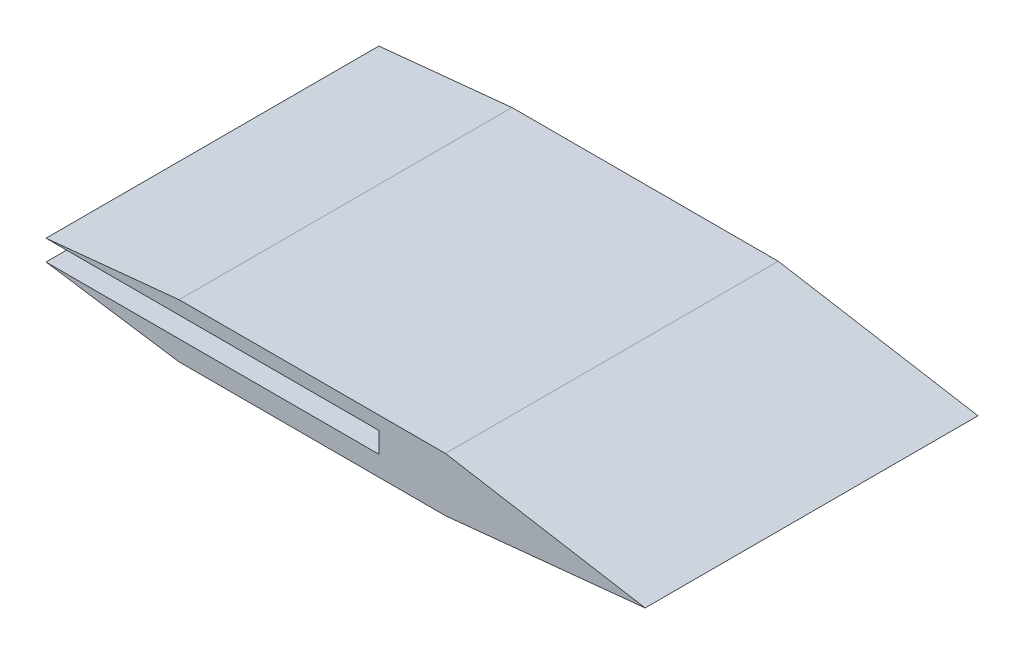
ISO-10303-21;
HEADER;
FILE_DESCRIPTION(('STEP AP214'),'2;1');
FILE_NAME('part.step','',(''),(''),'','','');
FILE_SCHEMA(('AUTOMOTIVE_DESIGN { 1 0 10303 214 1 1 1 1 }'));
ENDSEC;
DATA;
#1=APPLICATION_CONTEXT('core data for automotive mechanical design processes');
#2=APPLICATION_PROTOCOL_DEFINITION('international standard','automotive_design',2000,#1);
#3=PRODUCT_CONTEXT('',#1,'mechanical');
#4=PRODUCT('Part','Part','',(#3));
#5=PRODUCT_RELATED_PRODUCT_CATEGORY('part','',(#4));
#6=PRODUCT_DEFINITION_FORMATION('','',#4);
#7=PRODUCT_DEFINITION_CONTEXT('part definition',#1,'design');
#8=PRODUCT_DEFINITION('design','',#6,#7);
#9=PRODUCT_DEFINITION_SHAPE('','',#8);
#10=(LENGTH_UNIT() NAMED_UNIT(*) SI_UNIT(.MILLI.,.METRE.));
#11=(NAMED_UNIT(*) PLANE_ANGLE_UNIT() SI_UNIT($,.RADIAN.));
#12=(NAMED_UNIT(*) SI_UNIT($,.STERADIAN.) SOLID_ANGLE_UNIT());
#13=UNCERTAINTY_MEASURE_WITH_UNIT(LENGTH_MEASURE(1.E-05),#10,'distance_accuracy_value','');
#14=(GEOMETRIC_REPRESENTATION_CONTEXT(3) GLOBAL_UNCERTAINTY_ASSIGNED_CONTEXT((#13)) GLOBAL_UNIT_ASSIGNED_CONTEXT((#10,
#11,#12)) REPRESENTATION_CONTEXT('',''));
#15=CARTESIAN_POINT('',(0.,0.,0.));
#16=DIRECTION('',(0.,0.,1.));
#17=DIRECTION('',(1.,0.,0.));
#18=AXIS2_PLACEMENT_3D('',#15,#16,#17);
#19=CARTESIAN_POINT('',(50.,0.,50.));
#20=DIRECTION('',(0.,1.,0.));
#21=DIRECTION('',(-1.,0.,0.));
#22=AXIS2_PLACEMENT_3D('',#19,#20,#21);
#23=PLANE('',#22);
#24=DIRECTION('',(1.,0.,0.));
#25=VECTOR('',#24,1.);
#26=CARTESIAN_POINT('',(50.,0.,0.));
#27=LINE('',#26,#25);
#28=CARTESIAN_POINT('',(0.,0.,0.));
#29=VERTEX_POINT('',#28);
#30=CARTESIAN_POINT('',(50.,0.,0.));
#31=VERTEX_POINT('',#30);
#32=EDGE_CURVE('E135',#29,#31,#27,.T.);
#33=ORIENTED_EDGE('',*,*,#32,.T.);
#34=DIRECTION('',(0.,0.,-1.));
#35=VECTOR('',#34,1.);
#36=CARTESIAN_POINT('',(50.,0.,50.));
#37=LINE('',#36,#35);
#38=CARTESIAN_POINT('',(50.,0.,50.));
#39=VERTEX_POINT('',#38);
#40=EDGE_CURVE('E11',#39,#31,#37,.T.);
#41=ORIENTED_EDGE('',*,*,#40,.F.);
#42=DIRECTION('',(1.,0.,0.));
#43=VECTOR('',#42,1.);
#44=CARTESIAN_POINT('',(50.,0.,50.));
#45=LINE('',#44,#43);
#46=CARTESIAN_POINT('',(0.,0.,50.));
#47=VERTEX_POINT('',#46);
#48=EDGE_CURVE('E151',#47,#39,#45,.T.);
#49=ORIENTED_EDGE('',*,*,#48,.F.);
#50=DIRECTION('',(0.,0.,-1.));
#51=VECTOR('',#50,1.);
#52=CARTESIAN_POINT('',(0.,0.,50.));
#53=LINE('',#52,#51);
#54=EDGE_CURVE('E131',#47,#29,#53,.T.);
#55=ORIENTED_EDGE('',*,*,#54,.T.);
#56=EDGE_LOOP('',(#33,#41,#49,#55));
#57=FACE_BOUND('',#56,.T.);
#58=ADVANCED_FACE('F33',(#57),#23,.F.);
#59=CARTESIAN_POINT('',(50.,-3.1,50.));
#60=DIRECTION('',(1.,0.,0.));
#61=DIRECTION('',(0.,0.,-1.));
#62=AXIS2_PLACEMENT_3D('',#59,#60,#61);
#63=PLANE('',#62);
#64=DIRECTION('',(0.,-1.,0.));
#65=VECTOR('',#64,1.);
#66=CARTESIAN_POINT('',(50.,-3.1,0.));
#67=LINE('',#66,#65);
#68=CARTESIAN_POINT('',(50.,-3.1,0.));
#69=VERTEX_POINT('',#68);
#70=EDGE_CURVE('E138',#31,#69,#67,.T.);
#71=ORIENTED_EDGE('',*,*,#70,.T.);
#72=DIRECTION('',(0.,0.,-1.));
#73=VECTOR('',#72,1.);
#74=CARTESIAN_POINT('',(50.,-3.1,50.));
#75=LINE('',#74,#73);
#76=CARTESIAN_POINT('',(50.,-3.1,50.));
#77=VERTEX_POINT('',#76);
#78=EDGE_CURVE('E41',#77,#69,#75,.T.);
#79=ORIENTED_EDGE('',*,*,#78,.F.);
#80=DIRECTION('',(0.,-1.,0.));
#81=VECTOR('',#80,1.);
#82=CARTESIAN_POINT('',(50.,-3.1,50.));
#83=LINE('',#82,#81);
#84=EDGE_CURVE('E95',#39,#77,#83,.T.);
#85=ORIENTED_EDGE('',*,*,#84,.F.);
#86=ORIENTED_EDGE('',*,*,#40,.T.);
#87=EDGE_LOOP('',(#71,#79,#85,#86));
#88=FACE_BOUND('',#87,.T.);
#89=ADVANCED_FACE('F194',(#88),#63,.F.);
#90=CARTESIAN_POINT('',(0.,-3.1,50.));
#91=DIRECTION('',(0.,-1.,0.));
#92=DIRECTION('',(0.,0.,-1.));
#93=AXIS2_PLACEMENT_3D('',#90,#91,#92);
#94=PLANE('',#93);
#95=DIRECTION('',(-1.,0.,0.));
#96=VECTOR('',#95,1.);
#97=CARTESIAN_POINT('',(0.,-3.1,0.));
#98=LINE('',#97,#96);
#99=CARTESIAN_POINT('',(0.,-3.1,0.));
#100=VERTEX_POINT('',#99);
#101=EDGE_CURVE('E140',#69,#100,#98,.T.);
#102=ORIENTED_EDGE('',*,*,#101,.T.);
#103=DIRECTION('',(0.,0.,-1.));
#104=VECTOR('',#103,1.);
#105=CARTESIAN_POINT('',(0.,-3.1,50.));
#106=LINE('',#105,#104);
#107=CARTESIAN_POINT('',(0.,-3.1,50.));
#108=VERTEX_POINT('',#107);
#109=EDGE_CURVE('E161',#108,#100,#106,.T.);
#110=ORIENTED_EDGE('',*,*,#109,.F.);
#111=DIRECTION('',(-1.,0.,0.));
#112=VECTOR('',#111,1.);
#113=CARTESIAN_POINT('',(0.,-3.1,50.));
#114=LINE('',#113,#112);
#115=EDGE_CURVE('E169',#77,#108,#114,.T.);
#116=ORIENTED_EDGE('',*,*,#115,.F.);
#117=ORIENTED_EDGE('',*,*,#78,.T.);
#118=EDGE_LOOP('',(#102,#110,#116,#117));
#119=FACE_BOUND('',#118,.T.);
#120=ADVANCED_FACE('F167',(#119),#94,.F.);
#121=CARTESIAN_POINT('',(20.,-6.1,50.));
#122=DIRECTION('',(0.148340452930245,0.988936352868298,0.));
#123=DIRECTION('',(-0.988936352868298,0.148340452930245,0.));
#124=AXIS2_PLACEMENT_3D('',#121,#122,#123);
#125=PLANE('',#124);
#126=DIRECTION('',(0.988936352868298,-0.148340452930245,0.));
#127=VECTOR('',#126,1.);
#128=CARTESIAN_POINT('',(20.,-6.1,0.));
#129=LINE('',#128,#127);
#130=CARTESIAN_POINT('',(20.,-6.1,0.));
#131=VERTEX_POINT('',#130);
#132=EDGE_CURVE('E142',#100,#131,#129,.T.);
#133=ORIENTED_EDGE('',*,*,#132,.T.);
#134=DIRECTION('',(0.,0.,-1.));
#135=VECTOR('',#134,1.);
#136=CARTESIAN_POINT('',(20.,-6.1,50.));
#137=LINE('',#136,#135);
#138=CARTESIAN_POINT('',(20.,-6.1,50.));
#139=VERTEX_POINT('',#138);
#140=EDGE_CURVE('E158',#139,#131,#137,.T.);
#141=ORIENTED_EDGE('',*,*,#140,.F.);
#142=DIRECTION('',(0.988936352868298,-0.148340452930245,0.));
#143=VECTOR('',#142,1.);
#144=CARTESIAN_POINT('',(20.,-6.1,50.));
#145=LINE('',#144,#143);
#146=EDGE_CURVE('E185',#108,#139,#145,.T.);
#147=ORIENTED_EDGE('',*,*,#146,.F.);
#148=ORIENTED_EDGE('',*,*,#109,.T.);
#149=EDGE_LOOP('',(#133,#141,#147,#148));
#150=FACE_BOUND('',#149,.T.);
#151=ADVANCED_FACE('F178',(#150),#125,.F.);
#152=CARTESIAN_POINT('',(60.,-6.1,50.));
#153=DIRECTION('',(0.,1.,0.));
#154=DIRECTION('',(-1.,0.,0.));
#155=AXIS2_PLACEMENT_3D('',#152,#153,#154);
#156=PLANE('',#155);
#157=DIRECTION('',(1.,0.,0.));
#158=VECTOR('',#157,1.);
#159=CARTESIAN_POINT('',(60.,-6.1,0.));
#160=LINE('',#159,#158);
#161=CARTESIAN_POINT('',(60.,-6.1,0.));
#162=VERTEX_POINT('',#161);
#163=EDGE_CURVE('E144',#131,#162,#160,.T.);
#164=ORIENTED_EDGE('',*,*,#163,.T.);
#165=DIRECTION('',(0.,0.,-1.));
#166=VECTOR('',#165,1.);
#167=CARTESIAN_POINT('',(60.,-6.1,50.));
#168=LINE('',#167,#166);
#169=CARTESIAN_POINT('',(60.,-6.1,50.));
#170=VERTEX_POINT('',#169);
#171=EDGE_CURVE('E155',#170,#162,#168,.T.);
#172=ORIENTED_EDGE('',*,*,#171,.F.);
#173=DIRECTION('',(1.,0.,0.));
#174=VECTOR('',#173,1.);
#175=CARTESIAN_POINT('',(60.,-6.1,50.));
#176=LINE('',#175,#174);
#177=EDGE_CURVE('E184',#139,#170,#176,.T.);
#178=ORIENTED_EDGE('',*,*,#177,.F.);
#179=ORIENTED_EDGE('',*,*,#140,.T.);
#180=EDGE_LOOP('',(#164,#172,#178,#179));
#181=FACE_BOUND('',#180,.T.);
#182=ADVANCED_FACE('F182',(#181),#156,.F.);
#183=CARTESIAN_POINT('',(90.,-3.1,50.));
#184=DIRECTION('',(-0.0995037190209989,0.995037190209989,0.));
#185=DIRECTION('',(-0.995037190209989,-0.0995037190209989,0.));
#186=AXIS2_PLACEMENT_3D('',#183,#184,#185);
#187=PLANE('',#186);
#188=DIRECTION('',(0.995037190209989,0.0995037190209989,0.));
#189=VECTOR('',#188,1.);
#190=CARTESIAN_POINT('',(90.,-3.1,0.));
#191=LINE('',#190,#189);
#192=CARTESIAN_POINT('',(90.,-3.1,0.));
#193=VERTEX_POINT('',#192);
#194=EDGE_CURVE('E146',#162,#193,#191,.T.);
#195=ORIENTED_EDGE('',*,*,#194,.T.);
#196=DIRECTION('',(0.,0.,-1.));
#197=VECTOR('',#196,1.);
#198=CARTESIAN_POINT('',(90.,-3.1,50.));
#199=LINE('',#198,#197);
#200=CARTESIAN_POINT('',(90.,-3.1,50.));
#201=VERTEX_POINT('',#200);
#202=EDGE_CURVE('E126',#201,#193,#199,.T.);
#203=ORIENTED_EDGE('',*,*,#202,.F.);
#204=DIRECTION('',(0.995037190209989,0.0995037190209989,0.));
#205=VECTOR('',#204,1.);
#206=CARTESIAN_POINT('',(90.,-3.1,50.));
#207=LINE('',#206,#205);
#208=EDGE_CURVE('E117',#170,#201,#207,.T.);
#209=ORIENTED_EDGE('',*,*,#208,.F.);
#210=ORIENTED_EDGE('',*,*,#171,.T.);
#211=EDGE_LOOP('',(#195,#203,#209,#210));
#212=FACE_BOUND('',#211,.T.);
#213=ADVANCED_FACE('F206',(#212),#187,.F.);
#214=CARTESIAN_POINT('',(60.,2.,50.));
#215=DIRECTION('',(-0.167595493933869,-0.985855846669818,0.));
#216=DIRECTION('',(0.985855846669818,-0.167595493933869,0.));
#217=AXIS2_PLACEMENT_3D('',#214,#215,#216);
#218=PLANE('',#217);
#219=DIRECTION('',(-0.985855846669817,0.167595493933869,0.));
#220=VECTOR('',#219,1.);
#221=CARTESIAN_POINT('',(60.,2.,0.));
#222=LINE('',#221,#220);
#223=CARTESIAN_POINT('',(60.,2.,0.));
#224=VERTEX_POINT('',#223);
#225=EDGE_CURVE('E125',#193,#224,#222,.T.);
#226=ORIENTED_EDGE('',*,*,#225,.T.);
#227=DIRECTION('',(0.,0.,-1.));
#228=VECTOR('',#227,1.);
#229=CARTESIAN_POINT('',(60.,2.,50.));
#230=LINE('',#229,#228);
#231=CARTESIAN_POINT('',(60.,2.,50.));
#232=VERTEX_POINT('',#231);
#233=EDGE_CURVE('E122',#232,#224,#230,.T.);
#234=ORIENTED_EDGE('',*,*,#233,.F.);
#235=DIRECTION('',(-0.985855846669817,0.167595493933869,0.));
#236=VECTOR('',#235,1.);
#237=CARTESIAN_POINT('',(60.,2.,50.));
#238=LINE('',#237,#236);
#239=EDGE_CURVE('E111',#201,#232,#238,.T.);
#240=ORIENTED_EDGE('',*,*,#239,.F.);
#241=ORIENTED_EDGE('',*,*,#202,.T.);
#242=EDGE_LOOP('',(#226,#234,#240,#241));
#243=FACE_BOUND('',#242,.T.);
#244=ADVANCED_FACE('F123',(#243),#218,.F.);
#245=CARTESIAN_POINT('',(20.,2.,50.));
#246=DIRECTION('',(0.,-1.,0.));
#247=DIRECTION('',(0.,0.,-1.));
#248=AXIS2_PLACEMENT_3D('',#245,#246,#247);
#249=PLANE('',#248);
#250=DIRECTION('',(-1.,0.,0.));
#251=VECTOR('',#250,1.);
#252=CARTESIAN_POINT('',(20.,2.,0.));
#253=LINE('',#252,#251);
#254=CARTESIAN_POINT('',(20.,2.,0.));
#255=VERTEX_POINT('',#254);
#256=EDGE_CURVE('E81',#224,#255,#253,.T.);
#257=ORIENTED_EDGE('',*,*,#256,.T.);
#258=DIRECTION('',(0.,0.,-1.));
#259=VECTOR('',#258,1.);
#260=CARTESIAN_POINT('',(20.,2.,50.));
#261=LINE('',#260,#259);
#262=CARTESIAN_POINT('',(20.,2.,50.));
#263=VERTEX_POINT('',#262);
#264=EDGE_CURVE('E127',#263,#255,#261,.T.);
#265=ORIENTED_EDGE('',*,*,#264,.F.);
#266=DIRECTION('',(-1.,0.,0.));
#267=VECTOR('',#266,1.);
#268=CARTESIAN_POINT('',(20.,2.,50.));
#269=LINE('',#268,#267);
#270=EDGE_CURVE('E115',#232,#263,#269,.T.);
#271=ORIENTED_EDGE('',*,*,#270,.F.);
#272=ORIENTED_EDGE('',*,*,#233,.T.);
#273=EDGE_LOOP('',(#257,#265,#271,#272));
#274=FACE_BOUND('',#273,.T.);
#275=ADVANCED_FACE('F129',(#274),#249,.F.);
#276=CARTESIAN_POINT('',(0.,0.,50.));
#277=DIRECTION('',(0.0995037190209987,-0.995037190209989,0.));
#278=DIRECTION('',(0.995037190209989,0.0995037190209987,0.));
#279=AXIS2_PLACEMENT_3D('',#276,#277,#278);
#280=PLANE('',#279);
#281=DIRECTION('',(-0.995037190209989,-0.0995037190209987,0.));
#282=VECTOR('',#281,1.);
#283=CARTESIAN_POINT('',(0.,0.,0.));
#284=LINE('',#283,#282);
#285=EDGE_CURVE('E87',#255,#29,#284,.T.);
#286=ORIENTED_EDGE('',*,*,#285,.T.);
#287=ORIENTED_EDGE('',*,*,#54,.F.);
#288=DIRECTION('',(-0.995037190209989,-0.0995037190209987,0.));
#289=VECTOR('',#288,1.);
#290=CARTESIAN_POINT('',(0.,0.,50.));
#291=LINE('',#290,#289);
#292=EDGE_CURVE('E49',#263,#47,#291,.T.);
#293=ORIENTED_EDGE('',*,*,#292,.F.);
#294=ORIENTED_EDGE('',*,*,#264,.T.);
#295=EDGE_LOOP('',(#286,#287,#293,#294));
#296=FACE_BOUND('',#295,.T.);
#297=ADVANCED_FACE('F214',(#296),#280,.F.);
#298=CARTESIAN_POINT('',(0.,0.,50.));
#299=DIRECTION('',(0.,0.,-1.));
#300=DIRECTION('',(-1.,0.,0.));
#301=AXIS2_PLACEMENT_3D('',#298,#299,#300);
#302=PLANE('',#301);
#303=ORIENTED_EDGE('',*,*,#48,.T.);
#304=ORIENTED_EDGE('',*,*,#84,.T.);
#305=ORIENTED_EDGE('',*,*,#115,.T.);
#306=ORIENTED_EDGE('',*,*,#146,.T.);
#307=ORIENTED_EDGE('',*,*,#177,.T.);
#308=ORIENTED_EDGE('',*,*,#208,.T.);
#309=ORIENTED_EDGE('',*,*,#239,.T.);
#310=ORIENTED_EDGE('',*,*,#270,.T.);
#311=ORIENTED_EDGE('',*,*,#292,.T.);
#312=EDGE_LOOP('',(#303,#304,#305,#306,#307,#308,#309,#310,#311));
#313=FACE_BOUND('',#312,.T.);
#314=ADVANCED_FACE('F113',(#313),#302,.F.);
#315=CARTESIAN_POINT('',(0.,0.,0.));
#316=DIRECTION('',(0.,0.,-1.));
#317=DIRECTION('',(-1.,0.,0.));
#318=AXIS2_PLACEMENT_3D('',#315,#316,#317);
#319=PLANE('',#318);
#320=ORIENTED_EDGE('',*,*,#32,.F.);
#321=ORIENTED_EDGE('',*,*,#285,.F.);
#322=ORIENTED_EDGE('',*,*,#256,.F.);
#323=ORIENTED_EDGE('',*,*,#225,.F.);
#324=ORIENTED_EDGE('',*,*,#194,.F.);
#325=ORIENTED_EDGE('',*,*,#163,.F.);
#326=ORIENTED_EDGE('',*,*,#132,.F.);
#327=ORIENTED_EDGE('',*,*,#101,.F.);
#328=ORIENTED_EDGE('',*,*,#70,.F.);
#329=EDGE_LOOP('',(#320,#321,#322,#323,#324,#325,#326,#327,#328));
#330=FACE_BOUND('',#329,.T.);
#331=ADVANCED_FACE('F173',(#330),#319,.T.);
#332=CLOSED_SHELL('',(#58,#89,#120,#151,#182,#213,#244,#275,#297,#314,#331));
#333=MANIFOLD_SOLID_BREP('B2',#332);
#334=ADVANCED_BREP_SHAPE_REPRESENTATION('',(#18,#333),#14);
#335=SHAPE_DEFINITION_REPRESENTATION(#9,#334);
ENDSEC;
END-ISO-10303-21;
